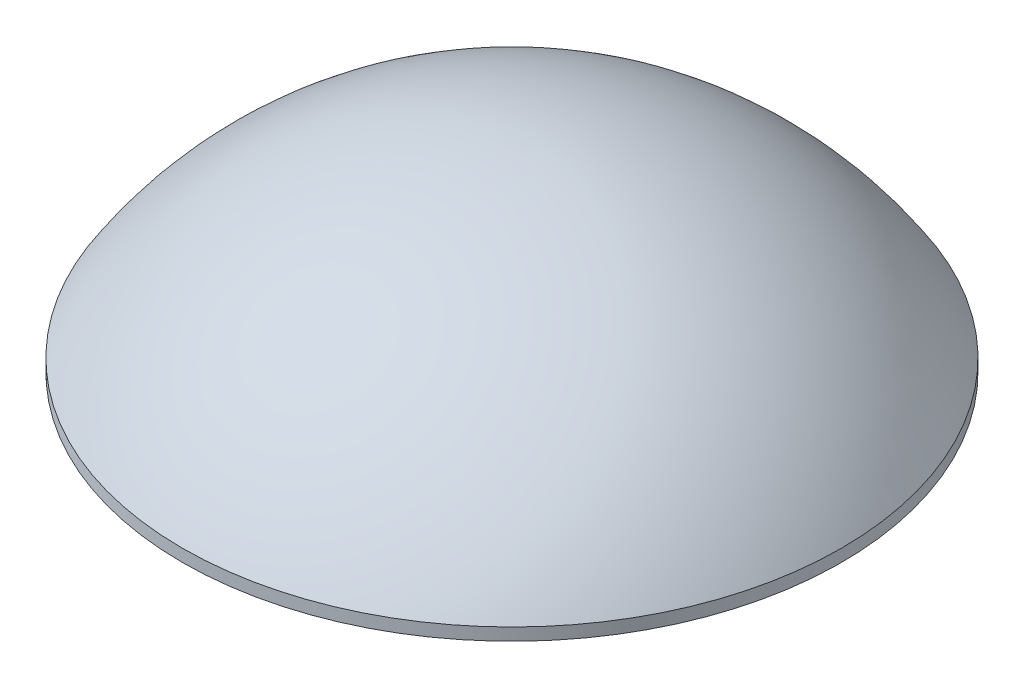
ISO-10303-21;
HEADER;
FILE_DESCRIPTION(('STEP AP214'),'2;1');
FILE_NAME('part.step','',(''),(''),'','','');
FILE_SCHEMA(('AUTOMOTIVE_DESIGN { 1 0 10303 214 1 1 1 1 }'));
ENDSEC;
DATA;
#1=APPLICATION_CONTEXT('core data for automotive mechanical design processes');
#2=APPLICATION_PROTOCOL_DEFINITION('international standard','automotive_design',2000,#1);
#3=PRODUCT_CONTEXT('',#1,'mechanical');
#4=PRODUCT('Part','Part','',(#3));
#5=PRODUCT_RELATED_PRODUCT_CATEGORY('part','',(#4));
#6=PRODUCT_DEFINITION_FORMATION('','',#4);
#7=PRODUCT_DEFINITION_CONTEXT('part definition',#1,'design');
#8=PRODUCT_DEFINITION('design','',#6,#7);
#9=PRODUCT_DEFINITION_SHAPE('','',#8);
#10=(LENGTH_UNIT() NAMED_UNIT(*) SI_UNIT(.MILLI.,.METRE.));
#11=(NAMED_UNIT(*) PLANE_ANGLE_UNIT() SI_UNIT($,.RADIAN.));
#12=(NAMED_UNIT(*) SI_UNIT($,.STERADIAN.) SOLID_ANGLE_UNIT());
#13=UNCERTAINTY_MEASURE_WITH_UNIT(LENGTH_MEASURE(1.E-05),#10,'distance_accuracy_value','');
#14=(GEOMETRIC_REPRESENTATION_CONTEXT(3) GLOBAL_UNCERTAINTY_ASSIGNED_CONTEXT((#13)) GLOBAL_UNIT_ASSIGNED_CONTEXT((#10,
#11,#12)) REPRESENTATION_CONTEXT('',''));
#15=CARTESIAN_POINT('',(0.,0.,0.));
#16=DIRECTION('',(0.,0.,1.));
#17=DIRECTION('',(1.,0.,0.));
#18=AXIS2_PLACEMENT_3D('',#15,#16,#17);
#19=CARTESIAN_POINT('',(0.,0.,0.));
#20=DIRECTION('',(0.,1.,0.));
#21=DIRECTION('',(-1.,0.,0.));
#22=AXIS2_PLACEMENT_3D('',#19,#20,#21);
#23=SPHERICAL_SURFACE('',#22,130.);
#24=CARTESIAN_POINT('',(0.,79.8185442112295,0.));
#25=DIRECTION('',(0.,1.,0.));
#26=DIRECTION('',(0.,0.,1.));
#27=AXIS2_PLACEMENT_3D('',#24,#25,#26);
#28=CIRCLE('',#27,102.610915598683);
#29=CARTESIAN_POINT('',(0.,79.8185442112295,102.610915598683));
#30=VERTEX_POINT('',#29);
#31=EDGE_CURVE('E44',#30,#30,#28,.T.);
#32=ORIENTED_EDGE('',*,*,#31,.F.);
#33=EDGE_LOOP('',(#32));
#34=FACE_BOUND('',#33,.T.);
#35=ADVANCED_FACE('F30',(#34),#23,.F.);
#36=CARTESIAN_POINT('',(0.,0.,0.));
#37=DIRECTION('',(0.,1.,0.));
#38=DIRECTION('',(1.,0.,0.));
#39=AXIS2_PLACEMENT_3D('',#36,#37,#38);
#40=SPHERICAL_SURFACE('',#39,150.);
#41=CARTESIAN_POINT('',(0.,79.8185442112295,0.));
#42=DIRECTION('',(0.,1.,0.));
#43=DIRECTION('',(0.,0.,1.));
#44=AXIS2_PLACEMENT_3D('',#41,#42,#43);
#45=CIRCLE('',#44,127.);
#46=CARTESIAN_POINT('',(0.,79.8185442112295,127.));
#47=VERTEX_POINT('',#46);
#48=EDGE_CURVE('E10',#47,#47,#45,.T.);
#49=ORIENTED_EDGE('',*,*,#48,.T.);
#50=EDGE_LOOP('',(#49));
#51=FACE_BOUND('',#50,.T.);
#52=ADVANCED_FACE('F54',(#51),#40,.T.);
#53=CARTESIAN_POINT('',(0.,153.747197789439,0.));
#54=DIRECTION('',(0.,1.,0.));
#55=DIRECTION('',(0.,0.,1.));
#56=AXIS2_PLACEMENT_3D('',#53,#54,#55);
#57=CYLINDRICAL_SURFACE('',#56,127.);
#58=CARTESIAN_POINT('',(0.,75.0560442112295,0.));
#59=DIRECTION('',(0.,1.,0.));
#60=DIRECTION('',(0.,0.,1.));
#61=AXIS2_PLACEMENT_3D('',#58,#59,#60);
#62=CIRCLE('',#61,127.);
#63=CARTESIAN_POINT('',(0.,75.0560442112295,127.));
#64=VERTEX_POINT('',#63);
#65=EDGE_CURVE('E36',#64,#64,#62,.T.);
#66=ORIENTED_EDGE('',*,*,#65,.T.);
#67=EDGE_LOOP('',(#66));
#68=FACE_BOUND('',#67,.T.);
#69=ORIENTED_EDGE('',*,*,#48,.F.);
#70=EDGE_LOOP('',(#69));
#71=FACE_BOUND('',#70,.T.);
#72=ADVANCED_FACE('F58',(#68,#71),#57,.T.);
#73=CARTESIAN_POINT('',(-127.,75.0560442112295,0.));
#74=DIRECTION('',(0.,-1.,0.));
#75=DIRECTION('',(0.,0.,-1.));
#76=AXIS2_PLACEMENT_3D('',#73,#74,#75);
#77=PLANE('',#76);
#78=CARTESIAN_POINT('',(0.,75.0560442112295,0.));
#79=DIRECTION('',(0.,1.,0.));
#80=DIRECTION('',(0.,0.,1.));
#81=AXIS2_PLACEMENT_3D('',#78,#79,#80);
#82=CIRCLE('',#81,102.610915598683);
#83=CARTESIAN_POINT('',(0.,75.0560442112295,102.610915598683));
#84=VERTEX_POINT('',#83);
#85=EDGE_CURVE('E40',#84,#84,#82,.T.);
#86=ORIENTED_EDGE('',*,*,#85,.T.);
#87=EDGE_LOOP('',(#86));
#88=FACE_BOUND('',#87,.T.);
#89=ORIENTED_EDGE('',*,*,#65,.F.);
#90=EDGE_LOOP('',(#89));
#91=FACE_BOUND('',#90,.T.);
#92=ADVANCED_FACE('F62',(#88,#91),#77,.T.);
#93=CARTESIAN_POINT('',(0.,153.747197789439,0.));
#94=DIRECTION('',(0.,1.,0.));
#95=DIRECTION('',(0.,0.,1.));
#96=AXIS2_PLACEMENT_3D('',#93,#94,#95);
#97=CYLINDRICAL_SURFACE('',#96,102.610915598683);
#98=ORIENTED_EDGE('',*,*,#31,.T.);
#99=EDGE_LOOP('',(#98));
#100=FACE_BOUND('',#99,.T.);
#101=ORIENTED_EDGE('',*,*,#85,.F.);
#102=EDGE_LOOP('',(#101));
#103=FACE_BOUND('',#102,.T.);
#104=ADVANCED_FACE('F50',(#100,#103),#97,.F.);
#105=CLOSED_SHELL('',(#35,#52,#72,#92,#104));
#106=MANIFOLD_SOLID_BREP('B2',#105);
#107=ADVANCED_BREP_SHAPE_REPRESENTATION('',(#18,#106),#14);
#108=SHAPE_DEFINITION_REPRESENTATION(#9,#107);
ENDSEC;
END-ISO-10303-21;
